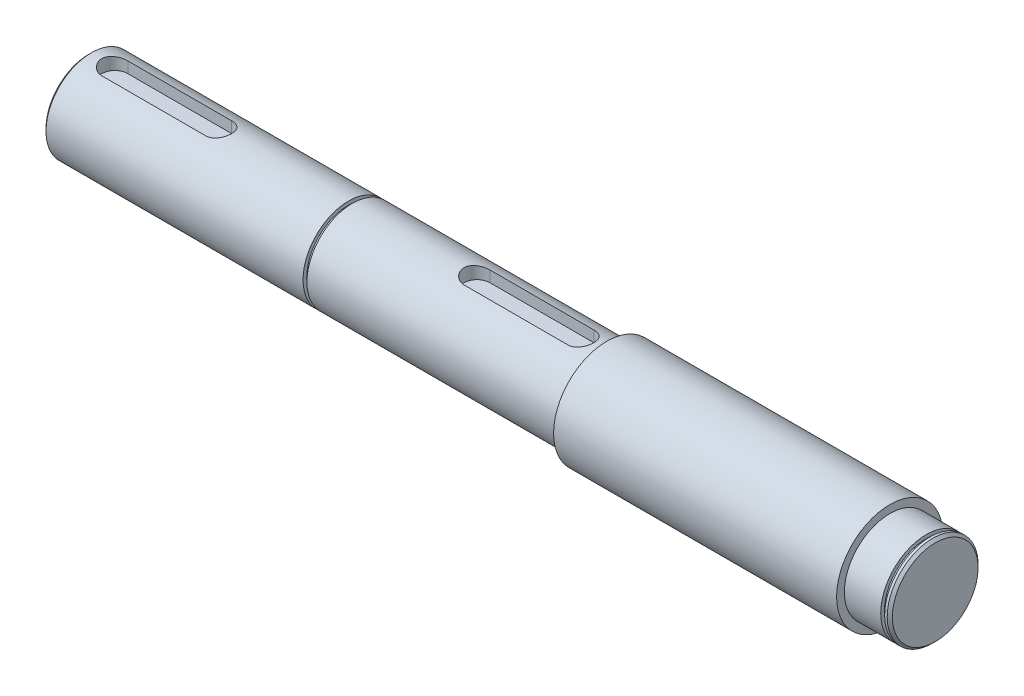
ISO-10303-21;
HEADER;
FILE_DESCRIPTION(('STEP AP214'),'2;1');
FILE_NAME('part.step','',(''),(''),'','','');
FILE_SCHEMA(('AUTOMOTIVE_DESIGN { 1 0 10303 214 1 1 1 1 }'));
ENDSEC;
DATA;
#1=APPLICATION_CONTEXT('core data for automotive mechanical design processes');
#2=APPLICATION_PROTOCOL_DEFINITION('international standard','automotive_design',2000,#1);
#3=PRODUCT_CONTEXT('',#1,'mechanical');
#4=PRODUCT('Part','Part','',(#3));
#5=PRODUCT_RELATED_PRODUCT_CATEGORY('part','',(#4));
#6=PRODUCT_DEFINITION_FORMATION('','',#4);
#7=PRODUCT_DEFINITION_CONTEXT('part definition',#1,'design');
#8=PRODUCT_DEFINITION('design','',#6,#7);
#9=PRODUCT_DEFINITION_SHAPE('','',#8);
#10=(LENGTH_UNIT() NAMED_UNIT(*) SI_UNIT(.MILLI.,.METRE.));
#11=(NAMED_UNIT(*) PLANE_ANGLE_UNIT() SI_UNIT($,.RADIAN.));
#12=(NAMED_UNIT(*) SI_UNIT($,.STERADIAN.) SOLID_ANGLE_UNIT());
#13=UNCERTAINTY_MEASURE_WITH_UNIT(LENGTH_MEASURE(1.E-05),#10,'distance_accuracy_value','');
#14=(GEOMETRIC_REPRESENTATION_CONTEXT(3) GLOBAL_UNCERTAINTY_ASSIGNED_CONTEXT((#13)) GLOBAL_UNIT_ASSIGNED_CONTEXT((#10,
#11,#12)) REPRESENTATION_CONTEXT('',''));
#15=CARTESIAN_POINT('',(0.,0.,0.));
#16=DIRECTION('',(0.,0.,1.));
#17=DIRECTION('',(1.,0.,0.));
#18=AXIS2_PLACEMENT_3D('',#15,#16,#17);
#19=CARTESIAN_POINT('',(0.,0.,0.));
#20=DIRECTION('',(1.,0.,0.));
#21=DIRECTION('',(0.,0.,-1.));
#22=AXIS2_PLACEMENT_3D('',#19,#20,#21);
#23=PLANE('',#22);
#24=CARTESIAN_POINT('',(0.,0.,0.));
#25=DIRECTION('',(-1.,0.,0.));
#26=DIRECTION('',(0.,0.,1.));
#27=AXIS2_PLACEMENT_3D('',#24,#25,#26);
#28=CIRCLE('',#27,16.5);
#29=CARTESIAN_POINT('',(0.,0.,16.5));
#30=VERTEX_POINT('',#29);
#31=EDGE_CURVE('E209',#30,#30,#28,.T.);
#32=ORIENTED_EDGE('',*,*,#31,.T.);
#33=EDGE_LOOP('',(#32));
#34=FACE_BOUND('',#33,.T.);
#35=ADVANCED_FACE('F47',(#34),#23,.F.);
#36=CARTESIAN_POINT('',(1.,0.,0.));
#37=DIRECTION('',(1.,0.,0.));
#38=DIRECTION('',(0.,0.,-1.));
#39=AXIS2_PLACEMENT_3D('',#36,#37,#38);
#40=CONICAL_SURFACE('',#39,17.5,0.785398163397449);
#41=ORIENTED_EDGE('',*,*,#31,.F.);
#42=EDGE_LOOP('',(#41));
#43=FACE_BOUND('',#42,.T.);
#44=CARTESIAN_POINT('',(1.,0.,0.));
#45=DIRECTION('',(-1.,0.,0.));
#46=DIRECTION('',(0.,0.,1.));
#47=AXIS2_PLACEMENT_3D('',#44,#45,#46);
#48=CIRCLE('',#47,17.5);
#49=CARTESIAN_POINT('',(1.,0.,17.5));
#50=VERTEX_POINT('',#49);
#51=EDGE_CURVE('E206',#50,#50,#48,.T.);
#52=ORIENTED_EDGE('',*,*,#51,.T.);
#53=EDGE_LOOP('',(#52));
#54=FACE_BOUND('',#53,.T.);
#55=ADVANCED_FACE('F292',(#43,#54),#40,.T.);
#56=CARTESIAN_POINT('',(0.,0.,0.));
#57=DIRECTION('',(-1.,0.,0.));
#58=DIRECTION('',(0.,0.,1.));
#59=AXIS2_PLACEMENT_3D('',#56,#57,#58);
#60=CYLINDRICAL_SURFACE('',#59,17.5);
#61=DIRECTION('',(-1.,0.,0.));
#62=VECTOR('',#61,1.);
#63=CARTESIAN_POINT('',(0.,16.7705098312485,-5.));
#64=LINE('',#63,#62);
#65=CARTESIAN_POINT('',(9.99999999999999,16.7705098312485,-5.));
#66=VERTEX_POINT('',#65);
#67=CARTESIAN_POINT('',(50.,16.7705098312485,-5.));
#68=VERTEX_POINT('',#67);
#69=EDGE_CURVE('E13',#66,#68,#64,.F.);
#70=ORIENTED_EDGE('',*,*,#69,.T.);
#71=CARTESIAN_POINT('',(50.,16.7705098312485,4.9999999999997));
#72=CARTESIAN_POINT('',(49.7253711553035,16.7705136752803,4.99999505116197));
#73=CARTESIAN_POINT('',(49.4506922893628,16.7773294919902,4.9772966649894));
#74=CARTESIAN_POINT('',(48.9093219028434,16.8037597301675,4.88730908475422));
#75=CARTESIAN_POINT('',(48.6426336772487,16.8233793574096,4.82000175340789));
#76=CARTESIAN_POINT('',(48.125156997821,16.8730177380414,4.64323358232149));
#77=CARTESIAN_POINT('',(47.874344620457,16.903020381435,4.53383801629678));
#78=CARTESIAN_POINT('',(47.3945804711141,16.9700230274029,4.27620910157344));
#79=CARTESIAN_POINT('',(47.1656312990549,17.0070238606297,4.12797114165866));
#80=CARTESIAN_POINT('',(46.7295210867129,17.0850445803541,3.79231200245496));
#81=CARTESIAN_POINT('',(46.523080494677,17.1261438991038,3.60397302783123));
#82=CARTESIAN_POINT('',(46.1442430417405,17.2070491378004,3.19542811367318));
#83=CARTESIAN_POINT('',(45.9718501671929,17.2468549058414,2.9752184478991));
#84=CARTESIAN_POINT('',(45.6629283791162,17.3215833000379,2.50411508039399));
#85=CARTESIAN_POINT('',(45.5271259506226,17.3564013625217,2.25272695940467));
#86=CARTESIAN_POINT('',(45.2999955639601,17.4163135121383,1.7295211880991));
#87=CARTESIAN_POINT('',(45.2086589468993,17.4414094922717,1.45770752718793));
#88=CARTESIAN_POINT('',(45.0754138469007,17.478487982506,0.908896437802953));
#89=CARTESIAN_POINT('',(45.0322774457383,17.4907956752825,0.632219495322609));
#90=CARTESIAN_POINT('',(44.9927831652919,17.5020523914924,0.0753002560548103));
#91=CARTESIAN_POINT('',(44.9964163441566,17.5010039684748,-0.204941348971377));
#92=CARTESIAN_POINT('',(45.0495159372951,17.4859001690826,-0.752450489338037));
#93=CARTESIAN_POINT('',(45.0976540315949,17.4722217694006,-1.01985886527232));
#94=CARTESIAN_POINT('',(45.236237756161,17.4338471582541,-1.54263055544407));
#95=CARTESIAN_POINT('',(45.3266859606555,17.4091502764083,-1.79799313575139));
#96=CARTESIAN_POINT('',(45.5482735020293,17.3509757943003,-2.29268458432219));
#97=CARTESIAN_POINT('',(45.67984694452,17.3174051377936,-2.53180760962648));
#98=CARTESIAN_POINT('',(45.9796114659959,17.2450692243607,-2.98501810897665));
#99=CARTESIAN_POINT('',(46.1478105691694,17.2063028298351,-3.19910008104169));
#100=CARTESIAN_POINT('',(46.5230142765432,17.1261420754531,-3.60408162136768));
#101=CARTESIAN_POINT('',(46.7311735840002,17.0847032340922,-3.79390394395575));
#102=CARTESIAN_POINT('',(47.1767877296273,17.0050743448172,-4.13623253938088));
#103=CARTESIAN_POINT('',(47.414244942419,16.9668845606665,-4.28873578448074));
#104=CARTESIAN_POINT('',(47.9143272112084,16.8978793698224,-4.55308339961719));
#105=CARTESIAN_POINT('',(48.1771380624751,16.8671252714536,-4.66459344463694));
#106=CARTESIAN_POINT('',(48.7188829086015,16.8172136076759,-4.84147378731837));
#107=CARTESIAN_POINT('',(48.9978121866012,16.7980526683095,-4.90685751004533));
#108=CARTESIAN_POINT('',(49.5537010608648,16.7742278804166,-4.98768543001692));
#109=CARTESIAN_POINT('',(49.8304045423417,16.7690927830537,-5.00475370393916));
#110=CARTESIAN_POINT('',(50.3827207897933,16.772603989784,-4.99297491798634));
#111=CARTESIAN_POINT('',(50.6583336875249,16.781248574778,-4.96413358561466));
#112=CARTESIAN_POINT('',(51.1941030700597,16.8108857513786,-4.86279453564957));
#113=CARTESIAN_POINT('',(51.4544689650385,16.8315910741458,-4.79131155460387));
#114=CARTESIAN_POINT('',(51.9595046799937,16.8827265982588,-4.60787904666037));
#115=CARTESIAN_POINT('',(52.204172229114,16.913158202776,-4.4959236806691));
#116=CARTESIAN_POINT('',(52.677555188042,16.9812547002375,-4.23154912804068));
#117=CARTESIAN_POINT('',(52.9057261105055,17.0190799345288,-4.0781972932283));
#118=CARTESIAN_POINT('',(53.3336909336084,17.0973431637451,-3.736511592121));
#119=CARTESIAN_POINT('',(53.5334786675303,17.1377817236902,-3.54817014420342));
#120=CARTESIAN_POINT('',(53.9059485457205,17.2183681859025,-3.13427002491391));
#121=CARTESIAN_POINT('',(54.0774874285468,17.2584601511536,-2.90766927560137));
#122=CARTESIAN_POINT('',(54.3801142034568,17.3324494261499,-2.42796326764385));
#123=CARTESIAN_POINT('',(54.5112042098059,17.3663470596354,-2.17485939524545));
#124=CARTESIAN_POINT('',(54.7279607175658,17.4239126211602,-1.65108318239042));
#125=CARTESIAN_POINT('',(54.8139709739654,17.4476577031811,-1.38056199974909));
#126=CARTESIAN_POINT('',(54.9390670048505,17.4825834905972,-0.828114121374802));
#127=CARTESIAN_POINT('',(54.9781648504533,17.4937674280758,-0.546190378963582));
#128=CARTESIAN_POINT('',(55.0074785849945,17.502133375082,0.0104455948975528));
#129=CARTESIAN_POINT('',(54.9993603727071,17.4997925897242,0.285064077624835));
#130=CARTESIAN_POINT('',(54.9384042964742,17.4824767280541,0.828862931055063));
#131=CARTESIAN_POINT('',(54.8855685740446,17.4675022567676,1.09804356154403));
#132=CARTESIAN_POINT('',(54.7376715975531,17.4267200465003,1.62101033259877));
#133=CARTESIAN_POINT('',(54.6429920526411,17.4010103511944,1.87491258358689));
#134=CARTESIAN_POINT('',(54.4144346042853,17.3414273535962,2.36336800690436));
#135=CARTESIAN_POINT('',(54.2805506322656,17.3075527875817,2.59791817645437));
#136=CARTESIAN_POINT('',(53.9727566564419,17.2339738859667,3.048583640882));
#137=CARTESIAN_POINT('',(53.7977747830439,17.1941261445115,3.26394332000721));
#138=CARTESIAN_POINT('',(53.4147271863503,17.1136016248075,3.6628030558064));
#139=CARTESIAN_POINT('',(53.2066523222323,17.072924620217,3.84629428051356));
#140=CARTESIAN_POINT('',(52.7567577075623,16.9941009380426,4.18102115069256));
#141=CARTESIAN_POINT('',(52.5141951314439,16.9560487921203,4.33128291794639));
#142=CARTESIAN_POINT('',(52.0061953369187,16.8882111312178,4.58869859034633));
#143=CARTESIAN_POINT('',(51.7407710223355,16.8584209924774,4.69587662208402));
#144=CARTESIAN_POINT('',(51.2308657493779,16.8139614893654,4.85246335034102));
#145=CARTESIAN_POINT('',(50.9882741297329,16.7978109709708,4.90764749955105));
#146=CARTESIAN_POINT('',(50.4971347041311,16.776084236542,4.98141517608441));
#147=CARTESIAN_POINT('',(50.2485878444253,16.7705063517175,5.00000447957614));
#148=CARTESIAN_POINT('',(50.,16.7705098312485,4.9999999999997));
#149=B_SPLINE_CURVE_WITH_KNOTS('',3,(#71,#72,#73,#74,#75,#76,#77,#78,#79,#80,#81,#82,#83,#84,
#85,#86,#87,#88,#89,#90,#91,#92,#93,#94,#95,#96,#97,#98,#99,#100,#101,#102,#103,#104,#105,#106,
#107,#108,#109,#110,#111,#112,#113,#114,#115,#116,#117,#118,#119,#120,#121,#122,#123,#124,#125,
#126,#127,#128,#129,#130,#131,#132,#133,#134,#135,#136,#137,#138,#139,#140,#141,#142,#143,#144,
#145,#146,#147,#148),.UNSPECIFIED.,.T.,.F.,(4,2,2,2,2,2,2,2,2,2,2,2,2,2,2,2,2,2,2,2,2,2,2,2,2,2,
2,2,2,2,2,2,2,2,2,2,2,2,4),(0.,0.822970855909897,1.64627652404721,2.4683104593411,
3.2904420275183,4.13392918016532,4.97751503096199,5.83678707534607,6.69589172544256,
7.53257252571846,8.36909336381037,9.18142594108545,9.99380794866297,10.8150725844622,
11.6365173296208,12.4867903173249,13.3371322657439,14.194263015785,15.0511441949007,
15.8788590834124,16.7064707175366,17.5151322414881,18.3239104804764,19.1527001511349,
19.981669615578,20.8386347094918,21.6955550021916,22.5458421325276,23.3959104269913,
24.2161724421769,25.0363951773397,25.8492853098056,26.6623013386559,27.4994942187097,
28.3369187479582,29.196340310631,30.0552799305202,30.8003322217913,31.545266903804),.UNSPECIFIED.);
#150=CARTESIAN_POINT('',(50.,16.7705098312485,4.9999999999997));
#151=VERTEX_POINT('',#150);
#152=EDGE_CURVE('E331',#68,#151,#149,.T.);
#153=ORIENTED_EDGE('',*,*,#152,.T.);
#154=DIRECTION('',(-1.,0.,0.));
#155=VECTOR('',#154,1.);
#156=CARTESIAN_POINT('',(0.,16.7705098312485,4.9999999999997));
#157=LINE('',#156,#155);
#158=CARTESIAN_POINT('',(9.99999999999999,16.7705098312485,4.9999999999997));
#159=VERTEX_POINT('',#158);
#160=EDGE_CURVE('E54',#151,#159,#157,.T.);
#161=ORIENTED_EDGE('',*,*,#160,.T.);
#162=CARTESIAN_POINT('',(9.99999999999999,16.7705098312485,4.9999999999997));
#163=CARTESIAN_POINT('',(9.86245623305311,16.7704912725158,5.00001814544044));
#164=CARTESIAN_POINT('',(9.72491937797705,16.7722013219269,4.99432529208162));
#165=CARTESIAN_POINT('',(9.45088881071551,16.7789431019967,4.97165222541635));
#166=CARTESIAN_POINT('',(9.31439488815718,16.7839741438635,4.95467435267921));
#167=CARTESIAN_POINT('',(9.04374154598048,16.7972068372471,4.90961903685606));
#168=CARTESIAN_POINT('',(8.90957737516659,16.8054009743522,4.88156789644736));
#169=CARTESIAN_POINT('',(8.64420035801119,16.8247046364186,4.81461674604709));
#170=CARTESIAN_POINT('',(8.51298757757804,16.8358142264157,4.77571649404028));
#171=CARTESIAN_POINT('',(8.25446833937773,16.8606149796879,4.68740449021921));
#172=CARTESIAN_POINT('',(8.12715994463587,16.874304837985,4.63799805032652));
#173=CARTESIAN_POINT('',(7.87720063727414,16.9038705765848,4.52905522001711));
#174=CARTESIAN_POINT('',(7.75455147662841,16.9197472690052,4.46951506432952));
#175=CARTESIAN_POINT('',(7.39479163969299,16.9699997678902,4.27631278448756));
#176=CARTESIAN_POINT('',(7.16570163810452,17.0070149050761,4.12801150136258));
#177=CARTESIAN_POINT('',(6.72948603513064,17.0850471293108,3.79229915782691));
#178=CARTESIAN_POINT('',(6.523079725343,17.1261428352533,3.60397767000143));
#179=CARTESIAN_POINT('',(6.14426230692642,17.2070462516998,3.19544341696381));
#180=CARTESIAN_POINT('',(5.97185683595896,17.2468537476933,2.97522537348191));
#181=CARTESIAN_POINT('',(5.66292190803247,17.3215844019063,2.50410851659379));
#182=CARTESIAN_POINT('',(5.52711907570153,17.3564029869975,2.25271539483173));
#183=CARTESIAN_POINT('',(5.29999228760768,17.4163145657263,1.72950937060036));
#184=CARTESIAN_POINT('',(5.20865769481189,17.4414098849258,1.45770136944961));
#185=CARTESIAN_POINT('',(5.07541429914927,17.4784878135793,0.908899275051312));
#186=CARTESIAN_POINT('',(5.03227814541031,17.4907954521753,0.632225504452077));
#187=CARTESIAN_POINT('',(4.99278330584537,17.5020523750682,0.075306092104837));
#188=CARTESIAN_POINT('',(4.99641666900432,17.5010039299559,-0.204938934421977));
#189=CARTESIAN_POINT('',(5.04951548019445,17.4859002467782,-0.752451373530215));
#190=CARTESIAN_POINT('',(5.09765239927416,17.4722220494947,-1.01985970934149));
#191=CARTESIAN_POINT('',(5.23624082954846,17.433846479088,-1.54263514692821));
#192=CARTESIAN_POINT('',(5.32669447701045,17.4091485496607,-1.79800164008106));
#193=CARTESIAN_POINT('',(5.54826637126564,17.3509771517083,-2.29267928834748));
#194=CARTESIAN_POINT('',(5.6798189520825,17.3174105731756,-2.53178407311227));
#195=CARTESIAN_POINT('',(5.97964433357546,17.2450626129451,-2.98504901208547));
#196=CARTESIAN_POINT('',(6.14792458727653,17.2062801734238,-3.19920408978388));
#197=CARTESIAN_POINT('',(6.42762735882452,17.1465202223137,-3.50113424709607));
#198=CARTESIAN_POINT('',(6.52736386434642,17.1259700648703,-3.60007423743551));
#199=CARTESIAN_POINT('',(6.73482024233987,17.0851123940087,-3.78923134613091));
#200=CARTESIAN_POINT('',(6.84253733987009,17.0648047990745,-3.87945147156873));
#201=CARTESIAN_POINT('',(7.06534504099314,17.0249868857383,-4.05062437518906));
#202=CARTESIAN_POINT('',(7.18044052987207,17.005477109874,-4.13157091233147));
#203=CARTESIAN_POINT('',(7.41716079370095,16.9678346429649,-4.28353981460235));
#204=CARTESIAN_POINT('',(7.53878300333381,16.9497014175387,-4.35456603991599));
#205=CARTESIAN_POINT('',(7.78891595131824,16.9151829895462,-4.48679157824973));
#206=CARTESIAN_POINT('',(7.91747862779707,16.8988148966381,-4.5478971849676));
#207=CARTESIAN_POINT('',(8.17954149635998,16.8685251216221,-4.65898872141544));
#208=CARTESIAN_POINT('',(8.31303965776124,16.8546024466245,-4.70897916633162));
#209=CARTESIAN_POINT('',(8.58392101135626,16.829649854127,-4.79739484975374));
#210=CARTESIAN_POINT('',(8.72129997925906,16.8186169160755,-4.83583217063301));
#211=CARTESIAN_POINT('',(8.99899554565236,16.799786563193,-4.90084834749728));
#212=CARTESIAN_POINT('',(9.13931075151927,16.7919876494694,-4.92743269748004));
#213=CARTESIAN_POINT('',(9.39966511421259,16.7808301521249,-4.96528740578586));
#214=CARTESIAN_POINT('',(9.51943162972835,16.776966894118,-4.97830600651657));
#215=CARTESIAN_POINT('',(9.75946229481565,16.7718034889731,-4.99566040544728));
#216=CARTESIAN_POINT('',(9.87972540377702,16.7704994326599,-5.00000944654162));
#217=CARTESIAN_POINT('',(9.99999999999999,16.7705098312485,-5.));
#218=B_SPLINE_CURVE_WITH_KNOTS('',3,(#162,#163,#164,#165,#166,#167,#168,#169,#170,#171,#172,
#173,#174,#175,#176,#177,#178,#179,#180,#181,#182,#183,#184,#185,#186,#187,#188,#189,#190,#191,
#192,#193,#194,#195,#196,#197,#198,#199,#200,#201,#202,#203,#204,#205,#206,#207,#208,#209,#210,
#211,#212,#213,#214,#215,#216,#217),.UNSPECIFIED.,.F.,.F.,(4,2,2,2,2,2,2,2,2,2,2,2,2,2,2,2,2,2,
2,2,2,2,2,2,2,2,2,4),(0.,0.412492178804591,0.824898831357995,1.23633171981255,1.64777378699047,
2.05900832185047,2.47039598941267,3.29264569343988,4.13611232627185,4.97971869650208,
5.83900986868945,6.69809539287321,7.53476732988528,8.37129703101926,9.18363381655584,
9.99601161556281,10.8172828992967,11.6387209961027,12.0642579015972,12.489647531354,
12.9153217832843,13.3408299328975,13.7701489130554,14.1992931759112,14.6279870611799,
15.056482034464,15.4177510461265,15.7784677892952),.UNSPECIFIED.);
#219=EDGE_CURVE('E61',#159,#66,#218,.T.);
#220=ORIENTED_EDGE('',*,*,#219,.T.);
#221=EDGE_LOOP('',(#70,#153,#161,#220));
#222=FACE_BOUND('',#221,.T.);
#223=ORIENTED_EDGE('',*,*,#51,.F.);
#224=EDGE_LOOP('',(#223));
#225=FACE_BOUND('',#224,.T.);
#226=CARTESIAN_POINT('',(100.,0.,0.));
#227=DIRECTION('',(-1.,0.,0.));
#228=DIRECTION('',(0.,0.,1.));
#229=AXIS2_PLACEMENT_3D('',#226,#227,#228);
#230=CIRCLE('',#229,17.5);
#231=CARTESIAN_POINT('',(100.,0.,17.5));
#232=VERTEX_POINT('',#231);
#233=EDGE_CURVE('E203',#232,#232,#230,.T.);
#234=ORIENTED_EDGE('',*,*,#233,.T.);
#235=EDGE_LOOP('',(#234));
#236=FACE_BOUND('',#235,.T.);
#237=ADVANCED_FACE('F297',(#222,#225,#236),#60,.T.);
#238=CARTESIAN_POINT('',(100.,17.5000000000001,0.));
#239=DIRECTION('',(-1.,0.,0.));
#240=DIRECTION('',(0.,0.,1.));
#241=AXIS2_PLACEMENT_3D('',#238,#239,#240);
#242=PLANE('',#241);
#243=ORIENTED_EDGE('',*,*,#233,.F.);
#244=EDGE_LOOP('',(#243));
#245=FACE_BOUND('',#244,.T.);
#246=CARTESIAN_POINT('',(100.,0.,0.));
#247=DIRECTION('',(-1.,0.,0.));
#248=DIRECTION('',(0.,0.,1.));
#249=AXIS2_PLACEMENT_3D('',#246,#247,#248);
#250=CIRCLE('',#249,16.1);
#251=CARTESIAN_POINT('',(100.,0.,16.1000000000001));
#252=VERTEX_POINT('',#251);
#253=EDGE_CURVE('E200',#252,#252,#250,.T.);
#254=ORIENTED_EDGE('',*,*,#253,.T.);
#255=EDGE_LOOP('',(#254));
#256=FACE_BOUND('',#255,.T.);
#257=ADVANCED_FACE('F305',(#245,#256),#242,.F.);
#258=CARTESIAN_POINT('',(0.,0.,0.));
#259=DIRECTION('',(-1.,0.,0.));
#260=DIRECTION('',(0.,0.,1.));
#261=AXIS2_PLACEMENT_3D('',#258,#259,#260);
#262=CYLINDRICAL_SURFACE('',#261,16.1);
#263=ORIENTED_EDGE('',*,*,#253,.F.);
#264=EDGE_LOOP('',(#263));
#265=FACE_BOUND('',#264,.T.);
#266=CARTESIAN_POINT('',(101.5,0.,0.));
#267=DIRECTION('',(-1.,0.,0.));
#268=DIRECTION('',(0.,0.,1.));
#269=AXIS2_PLACEMENT_3D('',#266,#267,#268);
#270=CIRCLE('',#269,16.1);
#271=CARTESIAN_POINT('',(101.5,0.,16.1));
#272=VERTEX_POINT('',#271);
#273=EDGE_CURVE('E197',#272,#272,#270,.T.);
#274=ORIENTED_EDGE('',*,*,#273,.T.);
#275=EDGE_LOOP('',(#274));
#276=FACE_BOUND('',#275,.T.);
#277=ADVANCED_FACE('F312',(#265,#276),#262,.T.);
#278=CARTESIAN_POINT('',(101.5,16.1000000000001,0.));
#279=DIRECTION('',(1.,0.,0.));
#280=DIRECTION('',(0.,0.,-1.));
#281=AXIS2_PLACEMENT_3D('',#278,#279,#280);
#282=PLANE('',#281);
#283=ORIENTED_EDGE('',*,*,#273,.F.);
#284=EDGE_LOOP('',(#283));
#285=FACE_BOUND('',#284,.T.);
#286=CARTESIAN_POINT('',(101.5,0.,0.));
#287=DIRECTION('',(-1.,0.,0.));
#288=DIRECTION('',(0.,0.,1.));
#289=AXIS2_PLACEMENT_3D('',#286,#287,#288);
#290=CIRCLE('',#289,17.5);
#291=CARTESIAN_POINT('',(101.5,0.,17.5000000000001));
#292=VERTEX_POINT('',#291);
#293=EDGE_CURVE('E194',#292,#292,#290,.T.);
#294=ORIENTED_EDGE('',*,*,#293,.T.);
#295=EDGE_LOOP('',(#294));
#296=FACE_BOUND('',#295,.T.);
#297=ADVANCED_FACE('F287',(#285,#296),#282,.F.);
#298=CARTESIAN_POINT('',(0.,0.,0.));
#299=DIRECTION('',(-1.,0.,0.));
#300=DIRECTION('',(0.,0.,1.));
#301=AXIS2_PLACEMENT_3D('',#298,#299,#300);
#302=CYLINDRICAL_SURFACE('',#301,17.5);
#303=DIRECTION('',(-1.,0.,0.));
#304=VECTOR('',#303,1.);
#305=CARTESIAN_POINT('',(0.,16.7705098312485,4.9999999999997));
#306=LINE('',#305,#304);
#307=CARTESIAN_POINT('',(189.5,16.7705098312485,4.9999999999997));
#308=VERTEX_POINT('',#307);
#309=CARTESIAN_POINT('',(149.5,16.7705098312485,4.9999999999997));
#310=VERTEX_POINT('',#309);
#311=EDGE_CURVE('E361',#308,#310,#306,.T.);
#312=ORIENTED_EDGE('',*,*,#311,.T.);
#313=CARTESIAN_POINT('',(149.5,16.7705098312485,4.9999999999997));
#314=CARTESIAN_POINT('',(149.362456233053,16.7704912725158,5.00001814544044));
#315=CARTESIAN_POINT('',(149.224919377977,16.7722013219269,4.99432529208162));
#316=CARTESIAN_POINT('',(148.950888810716,16.7789431019967,4.97165222541635));
#317=CARTESIAN_POINT('',(148.814394888157,16.7839741438636,4.9546743526792));
#318=CARTESIAN_POINT('',(148.543741545981,16.7972068372471,4.90961903685606));
#319=CARTESIAN_POINT('',(148.409577375167,16.8054009743523,4.88156789644736));
#320=CARTESIAN_POINT('',(148.144200358011,16.8247046364187,4.81461674604709));
#321=CARTESIAN_POINT('',(148.012987577578,16.8358142264157,4.77571649404028));
#322=CARTESIAN_POINT('',(147.754468339378,16.8606149796879,4.68740449021921));
#323=CARTESIAN_POINT('',(147.627159944636,16.874304837985,4.63799805032652));
#324=CARTESIAN_POINT('',(147.377200637274,16.9038705765848,4.52905522001713));
#325=CARTESIAN_POINT('',(147.254551476629,16.9197472690052,4.46951506432954));
#326=CARTESIAN_POINT('',(146.894791639693,16.9699997678902,4.27631278448757));
#327=CARTESIAN_POINT('',(146.665701638105,17.0070149050761,4.12801150136258));
#328=CARTESIAN_POINT('',(146.229486035131,17.0850471293108,3.79229915782691));
#329=CARTESIAN_POINT('',(146.023079725343,17.1261428352533,3.60397767000143));
#330=CARTESIAN_POINT('',(145.644262306927,17.2070462516998,3.19544341696382));
#331=CARTESIAN_POINT('',(145.471856835959,17.2468537476933,2.97522537348193));
#332=CARTESIAN_POINT('',(145.162921908033,17.3215844019063,2.50410851659382));
#333=CARTESIAN_POINT('',(145.027119075702,17.3564029869975,2.25271539483174));
#334=CARTESIAN_POINT('',(144.799992287608,17.4163145657263,1.72950937060037));
#335=CARTESIAN_POINT('',(144.708657694812,17.4414098849258,1.45770136944962));
#336=CARTESIAN_POINT('',(144.575414299149,17.4784878135793,0.908899275051314));
#337=CARTESIAN_POINT('',(144.53227814541,17.4907954521753,0.632225504452076));
#338=CARTESIAN_POINT('',(144.492783305845,17.5020523750682,0.0753060921048341));
#339=CARTESIAN_POINT('',(144.496416669004,17.501003929956,-0.204938934421978));
#340=CARTESIAN_POINT('',(144.549515480195,17.4859002467782,-0.752451373530215));
#341=CARTESIAN_POINT('',(144.597652399274,17.4722220494947,-1.01985970934149));
#342=CARTESIAN_POINT('',(144.736240829549,17.4338464790881,-1.54263514692821));
#343=CARTESIAN_POINT('',(144.826694477011,17.4091485496607,-1.79800164008106));
#344=CARTESIAN_POINT('',(145.048266371266,17.3509771517083,-2.29267928834748));
#345=CARTESIAN_POINT('',(145.179818952083,17.3174105731756,-2.53178407311226));
#346=CARTESIAN_POINT('',(145.479644333576,17.2450626129451,-2.98504901208545));
#347=CARTESIAN_POINT('',(145.647924587277,17.2062801734239,-3.19920408978386));
#348=CARTESIAN_POINT('',(145.927627358825,17.1465202223137,-3.50113424709604));
#349=CARTESIAN_POINT('',(146.027363864346,17.1259700648703,-3.60007423743549));
#350=CARTESIAN_POINT('',(146.23482024234,17.0851123940087,-3.78923134613088));
#351=CARTESIAN_POINT('',(146.34253733987,17.0648047990745,-3.8794514715687));
#352=CARTESIAN_POINT('',(146.565345040993,17.0249868857384,-4.05062437518903));
#353=CARTESIAN_POINT('',(146.680440529872,17.005477109874,-4.13157091233144));
#354=CARTESIAN_POINT('',(146.917160793701,16.967834642965,-4.28353981460233));
#355=CARTESIAN_POINT('',(147.038783003334,16.9497014175387,-4.35456603991598));
#356=CARTESIAN_POINT('',(147.288915951318,16.9151829895463,-4.48679157824973));
#357=CARTESIAN_POINT('',(147.417478627797,16.8988148966381,-4.54789718496759));
#358=CARTESIAN_POINT('',(147.67954149636,16.8685251216221,-4.65898872141543));
#359=CARTESIAN_POINT('',(147.813039657761,16.8546024466245,-4.70897916633161));
#360=CARTESIAN_POINT('',(148.083921011356,16.829649854127,-4.79739484975373));
#361=CARTESIAN_POINT('',(148.221299979259,16.8186169160755,-4.835832170633));
#362=CARTESIAN_POINT('',(148.498995545652,16.799786563193,-4.90084834749728));
#363=CARTESIAN_POINT('',(148.639310751519,16.7919876494694,-4.92743269748004));
#364=CARTESIAN_POINT('',(148.899665114213,16.7808301521249,-4.96528740578586));
#365=CARTESIAN_POINT('',(149.019431629728,16.776966894118,-4.97830600651657));
#366=CARTESIAN_POINT('',(149.259462294816,16.7718034889731,-4.99566040544728));
#367=CARTESIAN_POINT('',(149.379725403777,16.7704994326599,-5.00000944654161));
#368=CARTESIAN_POINT('',(149.5,16.7705098312485,-5.));
#369=B_SPLINE_CURVE_WITH_KNOTS('',3,(#313,#314,#315,#316,#317,#318,#319,#320,#321,#322,#323,
#324,#325,#326,#327,#328,#329,#330,#331,#332,#333,#334,#335,#336,#337,#338,#339,#340,#341,#342,
#343,#344,#345,#346,#347,#348,#349,#350,#351,#352,#353,#354,#355,#356,#357,#358,#359,#360,#361,
#362,#363,#364,#365,#366,#367,#368),.UNSPECIFIED.,.F.,.F.,(4,2,2,2,2,2,2,2,2,2,2,2,2,2,2,2,2,2,
2,2,2,2,2,2,2,2,2,4),(0.,0.412492178804638,0.824898831358004,1.23633171981254,1.64777378699046,
2.05900832185042,2.47039598941263,3.29264569343987,4.13611232627184,4.97971869650205,
5.83900986868943,6.69809539287321,7.53476732988528,8.37129703101926,9.18363381655584,
9.99601161556282,10.8172828992967,11.6387209961027,12.0642579015972,12.489647531354,
12.9153217832843,13.3408299328974,13.7701489130554,14.1992931759112,14.6279870611799,
15.056482034464,15.4177510461264,15.7784677892952),.UNSPECIFIED.);
#370=CARTESIAN_POINT('',(149.5,16.7705098312485,-5.));
#371=VERTEX_POINT('',#370);
#372=EDGE_CURVE('E212',#310,#371,#369,.T.);
#373=ORIENTED_EDGE('',*,*,#372,.T.);
#374=DIRECTION('',(-1.,0.,0.));
#375=VECTOR('',#374,1.);
#376=CARTESIAN_POINT('',(0.,16.7705098312485,-4.99999999999998));
#377=LINE('',#376,#375);
#378=CARTESIAN_POINT('',(189.5,16.7705098312485,-4.99999999999998));
#379=VERTEX_POINT('',#378);
#380=EDGE_CURVE('E357',#371,#379,#377,.F.);
#381=ORIENTED_EDGE('',*,*,#380,.T.);
#382=CARTESIAN_POINT('',(189.5,16.7705098312485,-5.));
#383=CARTESIAN_POINT('',(189.637543766947,16.7704912725158,-5.00001814544053));
#384=CARTESIAN_POINT('',(189.775080622023,16.7722013219269,-4.99432529208164));
#385=CARTESIAN_POINT('',(190.049111189285,16.7789431019967,-4.97165222541634));
#386=CARTESIAN_POINT('',(190.185605111843,16.7839741438635,-4.95467435267923));
#387=CARTESIAN_POINT('',(190.45625845402,16.7972068372471,-4.90961903685605));
#388=CARTESIAN_POINT('',(190.590422624834,16.8054009743522,-4.88156789644729));
#389=CARTESIAN_POINT('',(190.855799641989,16.8247046364187,-4.81461674604718));
#390=CARTESIAN_POINT('',(190.987012422422,16.8358142264157,-4.7757164940406));
#391=CARTESIAN_POINT('',(191.245531660623,16.8606149796879,-4.68740449021954));
#392=CARTESIAN_POINT('',(191.372840055364,16.874304837985,-4.63799805032664));
#393=CARTESIAN_POINT('',(191.622799362726,16.9038705765848,-4.52905522001707));
#394=CARTESIAN_POINT('',(191.745448523372,16.9197472690052,-4.46951506432953));
#395=CARTESIAN_POINT('',(192.105208360307,16.9699997678902,-4.27631278448764));
#396=CARTESIAN_POINT('',(192.334298361896,17.0070149050761,-4.12801150136261));
#397=CARTESIAN_POINT('',(192.77051396487,17.0850471293108,-3.7922991578269));
#398=CARTESIAN_POINT('',(192.976920274657,17.1261428352533,-3.60397767000141));
#399=CARTESIAN_POINT('',(193.355737693074,17.2070462516998,-3.1954434169638));
#400=CARTESIAN_POINT('',(193.528143164041,17.2468537476933,-2.9752253734819));
#401=CARTESIAN_POINT('',(193.837078091968,17.3215844019064,-2.50410851659379));
#402=CARTESIAN_POINT('',(193.972880924299,17.3564029869975,-2.25271539483172));
#403=CARTESIAN_POINT('',(194.200007712393,17.4163145657263,-1.72950937060035));
#404=CARTESIAN_POINT('',(194.291342305188,17.4414098849258,-1.45770136944961));
#405=CARTESIAN_POINT('',(194.424585700851,17.4784878135793,-0.908899275051312));
#406=CARTESIAN_POINT('',(194.46772185459,17.4907954521753,-0.632225504452074));
#407=CARTESIAN_POINT('',(194.507216694155,17.5020523750682,-0.0753060921048324));
#408=CARTESIAN_POINT('',(194.503583330996,17.5010039299559,0.204938934421979));
#409=CARTESIAN_POINT('',(194.450484519806,17.4859002467782,0.752451373530214));
#410=CARTESIAN_POINT('',(194.402347600726,17.4722220494947,1.01985970934149));
#411=CARTESIAN_POINT('',(194.263759170452,17.4338464790881,1.54263514692821));
#412=CARTESIAN_POINT('',(194.17330552299,17.4091485496607,1.79800164008106));
#413=CARTESIAN_POINT('',(193.951733628735,17.3509771517083,2.29267928834749));
#414=CARTESIAN_POINT('',(193.820181047918,17.3174105731756,2.53178407311228));
#415=CARTESIAN_POINT('',(193.520355666425,17.2450626129451,2.98504901208548));
#416=CARTESIAN_POINT('',(193.352075412724,17.2062801734239,3.19920408978388));
#417=CARTESIAN_POINT('',(193.072372641176,17.1465202223137,3.50113424709606));
#418=CARTESIAN_POINT('',(192.972636135654,17.1259700648703,3.60007423743549));
#419=CARTESIAN_POINT('',(192.76517975766,17.0851123940087,3.78923134613086));
#420=CARTESIAN_POINT('',(192.65746266013,17.0648047990745,3.87945147156866));
#421=CARTESIAN_POINT('',(192.434654959007,17.0249868857384,4.05062437518901));
#422=CARTESIAN_POINT('',(192.319559470128,17.005477109874,4.13157091233146));
#423=CARTESIAN_POINT('',(192.082839206299,16.967834642965,4.28353981460221));
#424=CARTESIAN_POINT('',(191.961216996667,16.9497014175387,4.35456603991568));
#425=CARTESIAN_POINT('',(191.711084048682,16.9151829895463,4.48679157824944));
#426=CARTESIAN_POINT('',(191.582521372203,16.8988148966381,4.54789718496749));
#427=CARTESIAN_POINT('',(191.32045850364,16.8685251216221,4.65898872141547));
#428=CARTESIAN_POINT('',(191.186960342239,16.8546024466245,4.70897916633158));
#429=CARTESIAN_POINT('',(190.916078988644,16.829649854127,4.79739484975372));
#430=CARTESIAN_POINT('',(190.778700020741,16.8186169160755,4.83583217063306));
#431=CARTESIAN_POINT('',(190.501004454348,16.799786563193,4.90084834749719));
#432=CARTESIAN_POINT('',(190.360689248481,16.7919876494694,4.92743269747972));
#433=CARTESIAN_POINT('',(190.100334885788,16.7808301521249,4.96528740578557));
#434=CARTESIAN_POINT('',(189.980568370272,16.776966894118,4.97830600651648));
#435=CARTESIAN_POINT('',(189.740537705185,16.7718034889731,4.99566040544737));
#436=CARTESIAN_POINT('',(189.620274596223,16.7704994326599,5.0000094465417));
#437=CARTESIAN_POINT('',(189.5,16.7705098312485,4.9999999999997));
#438=B_SPLINE_CURVE_WITH_KNOTS('',3,(#382,#383,#384,#385,#386,#387,#388,#389,#390,#391,#392,
#393,#394,#395,#396,#397,#398,#399,#400,#401,#402,#403,#404,#405,#406,#407,#408,#409,#410,#411,
#412,#413,#414,#415,#416,#417,#418,#419,#420,#421,#422,#423,#424,#425,#426,#427,#428,#429,#430,
#431,#432,#433,#434,#435,#436,#437),.UNSPECIFIED.,.F.,.F.,(4,2,2,2,2,2,2,2,2,2,2,2,2,2,2,2,2,2,
2,2,2,2,2,2,2,2,2,4),(0.,0.412492178804539,0.824898831357988,1.23633171981253,1.64777378699041,
2.05900832185043,2.47039598941264,3.29264569343994,4.13611232627192,4.97971869650214,
5.8390098686895,6.69809539287326,7.53476732988533,8.37129703101931,9.18363381655588,
9.99601161556286,10.8172828992968,11.6387209961027,12.0642579015972,12.489647531354,
12.9153217832842,13.3408299328974,13.7701489130553,14.1992931759111,14.6279870611798,
15.056482034464,15.4177510461264,15.7784677892952),.UNSPECIFIED.);
#439=EDGE_CURVE('E69',#379,#308,#438,.T.);
#440=ORIENTED_EDGE('',*,*,#439,.T.);
#441=EDGE_LOOP('',(#312,#373,#381,#440));
#442=FACE_BOUND('',#441,.T.);
#443=ORIENTED_EDGE('',*,*,#293,.F.);
#444=EDGE_LOOP('',(#443));
#445=FACE_BOUND('',#444,.T.);
#446=CARTESIAN_POINT('',(199.5,0.,0.));
#447=DIRECTION('',(-1.,0.,0.));
#448=DIRECTION('',(0.,0.,1.));
#449=AXIS2_PLACEMENT_3D('',#446,#447,#448);
#450=CIRCLE('',#449,17.5);
#451=CARTESIAN_POINT('',(199.5,0.,17.5));
#452=VERTEX_POINT('',#451);
#453=EDGE_CURVE('E191',#452,#452,#450,.T.);
#454=ORIENTED_EDGE('',*,*,#453,.T.);
#455=EDGE_LOOP('',(#454));
#456=FACE_BOUND('',#455,.T.);
#457=ADVANCED_FACE('F226',(#442,#445,#456),#302,.T.);
#458=CARTESIAN_POINT('',(199.5,17.5000000000001,0.));
#459=DIRECTION('',(1.,0.,0.));
#460=DIRECTION('',(0.,0.,-1.));
#461=AXIS2_PLACEMENT_3D('',#458,#459,#460);
#462=PLANE('',#461);
#463=ORIENTED_EDGE('',*,*,#453,.F.);
#464=EDGE_LOOP('',(#463));
#465=FACE_BOUND('',#464,.T.);
#466=CARTESIAN_POINT('',(199.5,0.,0.));
#467=DIRECTION('',(-1.,0.,0.));
#468=DIRECTION('',(0.,0.,1.));
#469=AXIS2_PLACEMENT_3D('',#466,#467,#468);
#470=CIRCLE('',#469,20.5);
#471=CARTESIAN_POINT('',(199.5,0.,20.5000000000001));
#472=VERTEX_POINT('',#471);
#473=EDGE_CURVE('E188',#472,#472,#470,.T.);
#474=ORIENTED_EDGE('',*,*,#473,.T.);
#475=EDGE_LOOP('',(#474));
#476=FACE_BOUND('',#475,.T.);
#477=ADVANCED_FACE('F280',(#465,#476),#462,.F.);
#478=CARTESIAN_POINT('',(0.,0.,0.));
#479=DIRECTION('',(-1.,0.,0.));
#480=DIRECTION('',(0.,0.,1.));
#481=AXIS2_PLACEMENT_3D('',#478,#479,#480);
#482=CYLINDRICAL_SURFACE('',#481,20.5);
#483=ORIENTED_EDGE('',*,*,#473,.F.);
#484=EDGE_LOOP('',(#483));
#485=FACE_BOUND('',#484,.T.);
#486=CARTESIAN_POINT('',(308.5,0.,0.));
#487=DIRECTION('',(-1.,0.,0.));
#488=DIRECTION('',(0.,0.,1.));
#489=AXIS2_PLACEMENT_3D('',#486,#487,#488);
#490=CIRCLE('',#489,20.5);
#491=CARTESIAN_POINT('',(308.5,0.,20.5000000000001));
#492=VERTEX_POINT('',#491);
#493=EDGE_CURVE('E185',#492,#492,#490,.T.);
#494=ORIENTED_EDGE('',*,*,#493,.T.);
#495=EDGE_LOOP('',(#494));
#496=FACE_BOUND('',#495,.T.);
#497=ADVANCED_FACE('F277',(#485,#496),#482,.T.);
#498=CARTESIAN_POINT('',(308.5,20.5000000000001,0.));
#499=DIRECTION('',(-1.,0.,0.));
#500=DIRECTION('',(0.,0.,1.));
#501=AXIS2_PLACEMENT_3D('',#498,#499,#500);
#502=PLANE('',#501);
#503=ORIENTED_EDGE('',*,*,#493,.F.);
#504=EDGE_LOOP('',(#503));
#505=FACE_BOUND('',#504,.T.);
#506=CARTESIAN_POINT('',(308.5,0.,0.));
#507=DIRECTION('',(-1.,0.,0.));
#508=DIRECTION('',(0.,0.,1.));
#509=AXIS2_PLACEMENT_3D('',#506,#507,#508);
#510=CIRCLE('',#509,17.5);
#511=CARTESIAN_POINT('',(308.5,0.,17.5));
#512=VERTEX_POINT('',#511);
#513=EDGE_CURVE('E182',#512,#512,#510,.T.);
#514=ORIENTED_EDGE('',*,*,#513,.T.);
#515=EDGE_LOOP('',(#514));
#516=FACE_BOUND('',#515,.T.);
#517=ADVANCED_FACE('F273',(#505,#516),#502,.F.);
#518=CARTESIAN_POINT('',(0.,0.,0.));
#519=DIRECTION('',(-1.,0.,0.));
#520=DIRECTION('',(0.,0.,1.));
#521=AXIS2_PLACEMENT_3D('',#518,#519,#520);
#522=CYLINDRICAL_SURFACE('',#521,17.5);
#523=ORIENTED_EDGE('',*,*,#513,.F.);
#524=EDGE_LOOP('',(#523));
#525=FACE_BOUND('',#524,.T.);
#526=CARTESIAN_POINT('',(322.5,0.,0.));
#527=DIRECTION('',(-1.,0.,0.));
#528=DIRECTION('',(0.,0.,1.));
#529=AXIS2_PLACEMENT_3D('',#526,#527,#528);
#530=CIRCLE('',#529,17.5);
#531=CARTESIAN_POINT('',(322.5,0.,17.5));
#532=VERTEX_POINT('',#531);
#533=EDGE_CURVE('E179',#532,#532,#530,.T.);
#534=ORIENTED_EDGE('',*,*,#533,.T.);
#535=EDGE_LOOP('',(#534));
#536=FACE_BOUND('',#535,.T.);
#537=ADVANCED_FACE('F269',(#525,#536),#522,.T.);
#538=CARTESIAN_POINT('',(322.5,16.1000000000001,0.));
#539=DIRECTION('',(-1.,0.,0.));
#540=DIRECTION('',(0.,0.,1.));
#541=AXIS2_PLACEMENT_3D('',#538,#539,#540);
#542=PLANE('',#541);
#543=ORIENTED_EDGE('',*,*,#533,.F.);
#544=EDGE_LOOP('',(#543));
#545=FACE_BOUND('',#544,.T.);
#546=CARTESIAN_POINT('',(322.5,0.,0.));
#547=DIRECTION('',(-1.,0.,0.));
#548=DIRECTION('',(0.,0.,1.));
#549=AXIS2_PLACEMENT_3D('',#546,#547,#548);
#550=CIRCLE('',#549,16.1);
#551=CARTESIAN_POINT('',(322.5,0.,16.1));
#552=VERTEX_POINT('',#551);
#553=EDGE_CURVE('E176',#552,#552,#550,.T.);
#554=ORIENTED_EDGE('',*,*,#553,.T.);
#555=EDGE_LOOP('',(#554));
#556=FACE_BOUND('',#555,.T.);
#557=ADVANCED_FACE('F265',(#545,#556),#542,.F.);
#558=CARTESIAN_POINT('',(0.,0.,0.));
#559=DIRECTION('',(-1.,0.,0.));
#560=DIRECTION('',(0.,0.,1.));
#561=AXIS2_PLACEMENT_3D('',#558,#559,#560);
#562=CYLINDRICAL_SURFACE('',#561,16.1);
#563=ORIENTED_EDGE('',*,*,#553,.F.);
#564=EDGE_LOOP('',(#563));
#565=FACE_BOUND('',#564,.T.);
#566=CARTESIAN_POINT('',(324.,0.,0.));
#567=DIRECTION('',(-1.,0.,0.));
#568=DIRECTION('',(0.,0.,1.));
#569=AXIS2_PLACEMENT_3D('',#566,#567,#568);
#570=CIRCLE('',#569,16.1);
#571=CARTESIAN_POINT('',(324.,0.,16.1));
#572=VERTEX_POINT('',#571);
#573=EDGE_CURVE('E173',#572,#572,#570,.T.);
#574=ORIENTED_EDGE('',*,*,#573,.T.);
#575=EDGE_LOOP('',(#574));
#576=FACE_BOUND('',#575,.T.);
#577=ADVANCED_FACE('F261',(#565,#576),#562,.T.);
#578=CARTESIAN_POINT('',(324.,17.5000000000001,0.));
#579=DIRECTION('',(1.,0.,0.));
#580=DIRECTION('',(0.,0.,-1.));
#581=AXIS2_PLACEMENT_3D('',#578,#579,#580);
#582=PLANE('',#581);
#583=ORIENTED_EDGE('',*,*,#573,.F.);
#584=EDGE_LOOP('',(#583));
#585=FACE_BOUND('',#584,.T.);
#586=CARTESIAN_POINT('',(324.,0.,0.));
#587=DIRECTION('',(-1.,0.,0.));
#588=DIRECTION('',(0.,0.,1.));
#589=AXIS2_PLACEMENT_3D('',#586,#587,#588);
#590=CIRCLE('',#589,17.5);
#591=CARTESIAN_POINT('',(324.,0.,17.5));
#592=VERTEX_POINT('',#591);
#593=EDGE_CURVE('E170',#592,#592,#590,.T.);
#594=ORIENTED_EDGE('',*,*,#593,.T.);
#595=EDGE_LOOP('',(#594));
#596=FACE_BOUND('',#595,.T.);
#597=ADVANCED_FACE('F257',(#585,#596),#582,.F.);
#598=CARTESIAN_POINT('',(0.,0.,0.));
#599=DIRECTION('',(-1.,0.,0.));
#600=DIRECTION('',(0.,0.,1.));
#601=AXIS2_PLACEMENT_3D('',#598,#599,#600);
#602=CYLINDRICAL_SURFACE('',#601,17.5);
#603=ORIENTED_EDGE('',*,*,#593,.F.);
#604=EDGE_LOOP('',(#603));
#605=FACE_BOUND('',#604,.T.);
#606=CARTESIAN_POINT('',(325.,0.,0.));
#607=DIRECTION('',(-1.,0.,0.));
#608=DIRECTION('',(0.,0.,1.));
#609=AXIS2_PLACEMENT_3D('',#606,#607,#608);
#610=CIRCLE('',#609,17.5);
#611=CARTESIAN_POINT('',(325.,0.,17.5));
#612=VERTEX_POINT('',#611);
#613=EDGE_CURVE('E167',#612,#612,#610,.T.);
#614=ORIENTED_EDGE('',*,*,#613,.T.);
#615=EDGE_LOOP('',(#614));
#616=FACE_BOUND('',#615,.T.);
#617=ADVANCED_FACE('F253',(#605,#616),#602,.T.);
#618=CARTESIAN_POINT('',(326.,0.,0.));
#619=DIRECTION('',(-1.,0.,0.));
#620=DIRECTION('',(0.,0.,1.));
#621=AXIS2_PLACEMENT_3D('',#618,#619,#620);
#622=CONICAL_SURFACE('',#621,16.5,0.785398163397447);
#623=ORIENTED_EDGE('',*,*,#613,.F.);
#624=EDGE_LOOP('',(#623));
#625=FACE_BOUND('',#624,.T.);
#626=CARTESIAN_POINT('',(326.,0.,0.));
#627=DIRECTION('',(-1.,0.,0.));
#628=DIRECTION('',(0.,0.,1.));
#629=AXIS2_PLACEMENT_3D('',#626,#627,#628);
#630=CIRCLE('',#629,16.5);
#631=CARTESIAN_POINT('',(326.,0.,16.5));
#632=VERTEX_POINT('',#631);
#633=EDGE_CURVE('E157',#632,#632,#630,.T.);
#634=ORIENTED_EDGE('',*,*,#633,.T.);
#635=EDGE_LOOP('',(#634));
#636=FACE_BOUND('',#635,.T.);
#637=ADVANCED_FACE('F249',(#625,#636),#622,.T.);
#638=CARTESIAN_POINT('',(326.,16.5000000000001,0.));
#639=DIRECTION('',(-1.,0.,0.));
#640=DIRECTION('',(0.,0.,1.));
#641=AXIS2_PLACEMENT_3D('',#638,#639,#640);
#642=PLANE('',#641);
#643=ORIENTED_EDGE('',*,*,#633,.F.);
#644=EDGE_LOOP('',(#643));
#645=FACE_BOUND('',#644,.T.);
#646=ADVANCED_FACE('F246',(#645),#642,.F.);
#647=CARTESIAN_POINT('',(189.5,12.5000000000001,0.));
#648=DIRECTION('',(0.,1.,0.));
#649=DIRECTION('',(0.,0.,1.));
#650=AXIS2_PLACEMENT_3D('',#647,#648,#649);
#651=CYLINDRICAL_SURFACE('',#650,5.);
#652=DIRECTION('',(0.,1.,0.));
#653=VECTOR('',#652,1.);
#654=CARTESIAN_POINT('',(189.5,12.5000000000001,-5.));
#655=LINE('',#654,#653);
#656=CARTESIAN_POINT('',(189.5,12.5000000000001,-5.));
#657=VERTEX_POINT('',#656);
#658=EDGE_CURVE('E154',#657,#379,#655,.T.);
#659=ORIENTED_EDGE('',*,*,#658,.F.);
#660=CARTESIAN_POINT('',(189.5,12.5000000000001,0.));
#661=DIRECTION('',(0.,1.,0.));
#662=DIRECTION('',(0.,0.,1.));
#663=AXIS2_PLACEMENT_3D('',#660,#661,#662);
#664=CIRCLE('',#663,5.);
#665=CARTESIAN_POINT('',(189.5,12.5000000000001,4.9999999999997));
#666=VERTEX_POINT('',#665);
#667=EDGE_CURVE('E138',#666,#657,#664,.T.);
#668=ORIENTED_EDGE('',*,*,#667,.F.);
#669=DIRECTION('',(0.,1.,0.));
#670=VECTOR('',#669,1.);
#671=CARTESIAN_POINT('',(189.5,12.5000000000001,4.9999999999997));
#672=LINE('',#671,#670);
#673=EDGE_CURVE('E155',#666,#308,#672,.T.);
#674=ORIENTED_EDGE('',*,*,#673,.T.);
#675=ORIENTED_EDGE('',*,*,#439,.F.);
#676=EDGE_LOOP('',(#659,#668,#674,#675));
#677=FACE_BOUND('',#676,.T.);
#678=ADVANCED_FACE('F242',(#677),#651,.F.);
#679=CARTESIAN_POINT('',(189.5,12.5000000000001,4.9999999999997));
#680=DIRECTION('',(0.,0.,1.));
#681=DIRECTION('',(1.,0.,0.));
#682=AXIS2_PLACEMENT_3D('',#679,#680,#681);
#683=PLANE('',#682);
#684=ORIENTED_EDGE('',*,*,#673,.F.);
#685=DIRECTION('',(1.,0.,0.));
#686=VECTOR('',#685,1.);
#687=CARTESIAN_POINT('',(189.5,12.5000000000001,4.9999999999997));
#688=LINE('',#687,#686);
#689=CARTESIAN_POINT('',(149.5,12.5000000000001,4.9999999999997));
#690=VERTEX_POINT('',#689);
#691=EDGE_CURVE('E151',#690,#666,#688,.T.);
#692=ORIENTED_EDGE('',*,*,#691,.F.);
#693=DIRECTION('',(0.,1.,0.));
#694=VECTOR('',#693,1.);
#695=CARTESIAN_POINT('',(149.5,12.5000000000001,4.9999999999997));
#696=LINE('',#695,#694);
#697=EDGE_CURVE('E158',#690,#310,#696,.T.);
#698=ORIENTED_EDGE('',*,*,#697,.T.);
#699=ORIENTED_EDGE('',*,*,#311,.F.);
#700=EDGE_LOOP('',(#684,#692,#698,#699));
#701=FACE_BOUND('',#700,.T.);
#702=ADVANCED_FACE('F236',(#701),#683,.F.);
#703=CARTESIAN_POINT('',(149.5,12.5000000000001,0.));
#704=DIRECTION('',(0.,1.,0.));
#705=DIRECTION('',(0.,0.,1.));
#706=AXIS2_PLACEMENT_3D('',#703,#704,#705);
#707=CYLINDRICAL_SURFACE('',#706,5.);
#708=ORIENTED_EDGE('',*,*,#697,.F.);
#709=CARTESIAN_POINT('',(149.5,12.5000000000001,0.));
#710=DIRECTION('',(0.,1.,0.));
#711=DIRECTION('',(0.,0.,1.));
#712=AXIS2_PLACEMENT_3D('',#709,#710,#711);
#713=CIRCLE('',#712,5.);
#714=CARTESIAN_POINT('',(149.5,12.5000000000001,-5.));
#715=VERTEX_POINT('',#714);
#716=EDGE_CURVE('E148',#715,#690,#713,.T.);
#717=ORIENTED_EDGE('',*,*,#716,.F.);
#718=DIRECTION('',(0.,1.,0.));
#719=VECTOR('',#718,1.);
#720=CARTESIAN_POINT('',(149.5,12.5000000000001,-5.));
#721=LINE('',#720,#719);
#722=EDGE_CURVE('E161',#715,#371,#721,.T.);
#723=ORIENTED_EDGE('',*,*,#722,.T.);
#724=ORIENTED_EDGE('',*,*,#372,.F.);
#725=EDGE_LOOP('',(#708,#717,#723,#724));
#726=FACE_BOUND('',#725,.T.);
#727=ADVANCED_FACE('F230',(#726),#707,.F.);
#728=CARTESIAN_POINT('',(189.5,12.5000000000001,-5.));
#729=DIRECTION('',(0.,0.,-1.));
#730=DIRECTION('',(-1.,0.,0.));
#731=AXIS2_PLACEMENT_3D('',#728,#729,#730);
#732=PLANE('',#731);
#733=ORIENTED_EDGE('',*,*,#722,.F.);
#734=DIRECTION('',(-1.,0.,0.));
#735=VECTOR('',#734,1.);
#736=CARTESIAN_POINT('',(189.5,12.5000000000001,-5.));
#737=LINE('',#736,#735);
#738=EDGE_CURVE('E145',#657,#715,#737,.T.);
#739=ORIENTED_EDGE('',*,*,#738,.F.);
#740=ORIENTED_EDGE('',*,*,#658,.T.);
#741=ORIENTED_EDGE('',*,*,#380,.F.);
#742=EDGE_LOOP('',(#733,#739,#740,#741));
#743=FACE_BOUND('',#742,.T.);
#744=ADVANCED_FACE('F235',(#743),#732,.F.);
#745=CARTESIAN_POINT('',(189.5,12.5000000000001,0.));
#746=DIRECTION('',(0.,1.,0.));
#747=DIRECTION('',(0.,0.,1.));
#748=AXIS2_PLACEMENT_3D('',#745,#746,#747);
#749=PLANE('',#748);
#750=ORIENTED_EDGE('',*,*,#667,.T.);
#751=ORIENTED_EDGE('',*,*,#738,.T.);
#752=ORIENTED_EDGE('',*,*,#716,.T.);
#753=ORIENTED_EDGE('',*,*,#691,.T.);
#754=EDGE_LOOP('',(#750,#751,#752,#753));
#755=FACE_BOUND('',#754,.T.);
#756=ADVANCED_FACE('F240',(#755),#749,.T.);
#757=CARTESIAN_POINT('',(9.99999999999999,12.5000000000001,0.));
#758=DIRECTION('',(0.,1.,0.));
#759=DIRECTION('',(0.,0.,1.));
#760=AXIS2_PLACEMENT_3D('',#757,#758,#759);
#761=CYLINDRICAL_SURFACE('',#760,5.);
#762=DIRECTION('',(0.,1.,0.));
#763=VECTOR('',#762,1.);
#764=CARTESIAN_POINT('',(9.99999999999999,12.5000000000001,4.9999999999997));
#765=LINE('',#764,#763);
#766=CARTESIAN_POINT('',(9.99999999999999,12.5000000000001,4.9999999999997));
#767=VERTEX_POINT('',#766);
#768=EDGE_CURVE('E110',#767,#159,#765,.T.);
#769=ORIENTED_EDGE('',*,*,#768,.F.);
#770=CARTESIAN_POINT('',(9.99999999999999,12.5000000000001,0.));
#771=DIRECTION('',(0.,1.,0.));
#772=DIRECTION('',(0.,0.,1.));
#773=AXIS2_PLACEMENT_3D('',#770,#771,#772);
#774=CIRCLE('',#773,5.);
#775=CARTESIAN_POINT('',(9.99999999999999,12.5000000000001,-5.));
#776=VERTEX_POINT('',#775);
#777=EDGE_CURVE('E114',#776,#767,#774,.T.);
#778=ORIENTED_EDGE('',*,*,#777,.F.);
#779=DIRECTION('',(0.,1.,0.));
#780=VECTOR('',#779,1.);
#781=CARTESIAN_POINT('',(9.99999999999999,12.5000000000001,-5.));
#782=LINE('',#781,#780);
#783=EDGE_CURVE('E136',#776,#66,#782,.T.);
#784=ORIENTED_EDGE('',*,*,#783,.T.);
#785=ORIENTED_EDGE('',*,*,#219,.F.);
#786=EDGE_LOOP('',(#769,#778,#784,#785));
#787=FACE_BOUND('',#786,.T.);
#788=ADVANCED_FACE('F112',(#787),#761,.F.);
#789=CARTESIAN_POINT('',(9.99999999999999,12.5000000000001,-5.));
#790=DIRECTION('',(0.,0.,-1.));
#791=DIRECTION('',(-1.,0.,0.));
#792=AXIS2_PLACEMENT_3D('',#789,#790,#791);
#793=PLANE('',#792);
#794=ORIENTED_EDGE('',*,*,#783,.F.);
#795=DIRECTION('',(-1.,0.,0.));
#796=VECTOR('',#795,1.);
#797=CARTESIAN_POINT('',(9.99999999999999,12.5000000000001,-5.));
#798=LINE('',#797,#796);
#799=CARTESIAN_POINT('',(50.,12.5000000000001,-5.));
#800=VERTEX_POINT('',#799);
#801=EDGE_CURVE('E119',#800,#776,#798,.T.);
#802=ORIENTED_EDGE('',*,*,#801,.F.);
#803=DIRECTION('',(0.,1.,0.));
#804=VECTOR('',#803,1.);
#805=CARTESIAN_POINT('',(50.,12.5000000000001,-5.));
#806=LINE('',#805,#804);
#807=EDGE_CURVE('E139',#800,#68,#806,.T.);
#808=ORIENTED_EDGE('',*,*,#807,.T.);
#809=ORIENTED_EDGE('',*,*,#69,.F.);
#810=EDGE_LOOP('',(#794,#802,#808,#809));
#811=FACE_BOUND('',#810,.T.);
#812=ADVANCED_FACE('F346',(#811),#793,.F.);
#813=CARTESIAN_POINT('',(50.,12.5000000000001,0.));
#814=DIRECTION('',(0.,1.,0.));
#815=DIRECTION('',(0.,0.,1.));
#816=AXIS2_PLACEMENT_3D('',#813,#814,#815);
#817=CYLINDRICAL_SURFACE('',#816,5.);
#818=ORIENTED_EDGE('',*,*,#807,.F.);
#819=CARTESIAN_POINT('',(50.,12.5000000000001,0.));
#820=DIRECTION('',(0.,1.,0.));
#821=DIRECTION('',(0.,0.,1.));
#822=AXIS2_PLACEMENT_3D('',#819,#820,#821);
#823=CIRCLE('',#822,5.);
#824=CARTESIAN_POINT('',(50.,12.5000000000001,4.9999999999997));
#825=VERTEX_POINT('',#824);
#826=EDGE_CURVE('E128',#825,#800,#823,.T.);
#827=ORIENTED_EDGE('',*,*,#826,.F.);
#828=DIRECTION('',(0.,1.,0.));
#829=VECTOR('',#828,1.);
#830=CARTESIAN_POINT('',(50.,12.5000000000001,4.9999999999997));
#831=LINE('',#830,#829);
#832=EDGE_CURVE('E118',#825,#151,#831,.T.);
#833=ORIENTED_EDGE('',*,*,#832,.T.);
#834=ORIENTED_EDGE('',*,*,#152,.F.);
#835=EDGE_LOOP('',(#818,#827,#833,#834));
#836=FACE_BOUND('',#835,.T.);
#837=ADVANCED_FACE('F364',(#836),#817,.F.);
#838=CARTESIAN_POINT('',(9.99999999999999,12.5000000000001,4.9999999999997));
#839=DIRECTION('',(0.,0.,1.));
#840=DIRECTION('',(1.,0.,0.));
#841=AXIS2_PLACEMENT_3D('',#838,#839,#840);
#842=PLANE('',#841);
#843=ORIENTED_EDGE('',*,*,#832,.F.);
#844=DIRECTION('',(1.,0.,0.));
#845=VECTOR('',#844,1.);
#846=CARTESIAN_POINT('',(9.99999999999999,12.5000000000001,4.9999999999997));
#847=LINE('',#846,#845);
#848=EDGE_CURVE('E122',#767,#825,#847,.T.);
#849=ORIENTED_EDGE('',*,*,#848,.F.);
#850=ORIENTED_EDGE('',*,*,#768,.T.);
#851=ORIENTED_EDGE('',*,*,#160,.F.);
#852=EDGE_LOOP('',(#843,#849,#850,#851));
#853=FACE_BOUND('',#852,.T.);
#854=ADVANCED_FACE('F123',(#853),#842,.F.);
#855=CARTESIAN_POINT('',(9.99999999999999,12.5000000000001,0.));
#856=DIRECTION('',(0.,1.,0.));
#857=DIRECTION('',(0.,0.,1.));
#858=AXIS2_PLACEMENT_3D('',#855,#856,#857);
#859=PLANE('',#858);
#860=ORIENTED_EDGE('',*,*,#777,.T.);
#861=ORIENTED_EDGE('',*,*,#848,.T.);
#862=ORIENTED_EDGE('',*,*,#826,.T.);
#863=ORIENTED_EDGE('',*,*,#801,.T.);
#864=EDGE_LOOP('',(#860,#861,#862,#863));
#865=FACE_BOUND('',#864,.T.);
#866=ADVANCED_FACE('F130',(#865),#859,.T.);
#867=CLOSED_SHELL('',(#35,#55,#237,#257,#277,#297,#457,#477,#497,#517,#537,#557,#577,#597,#617,
#637,#646,#678,#702,#727,#744,#756,#788,#812,#837,#854,#866));
#868=MANIFOLD_SOLID_BREP('B2',#867);
#869=ADVANCED_BREP_SHAPE_REPRESENTATION('',(#18,#868),#14);
#870=SHAPE_DEFINITION_REPRESENTATION(#9,#869);
ENDSEC;
END-ISO-10303-21;
